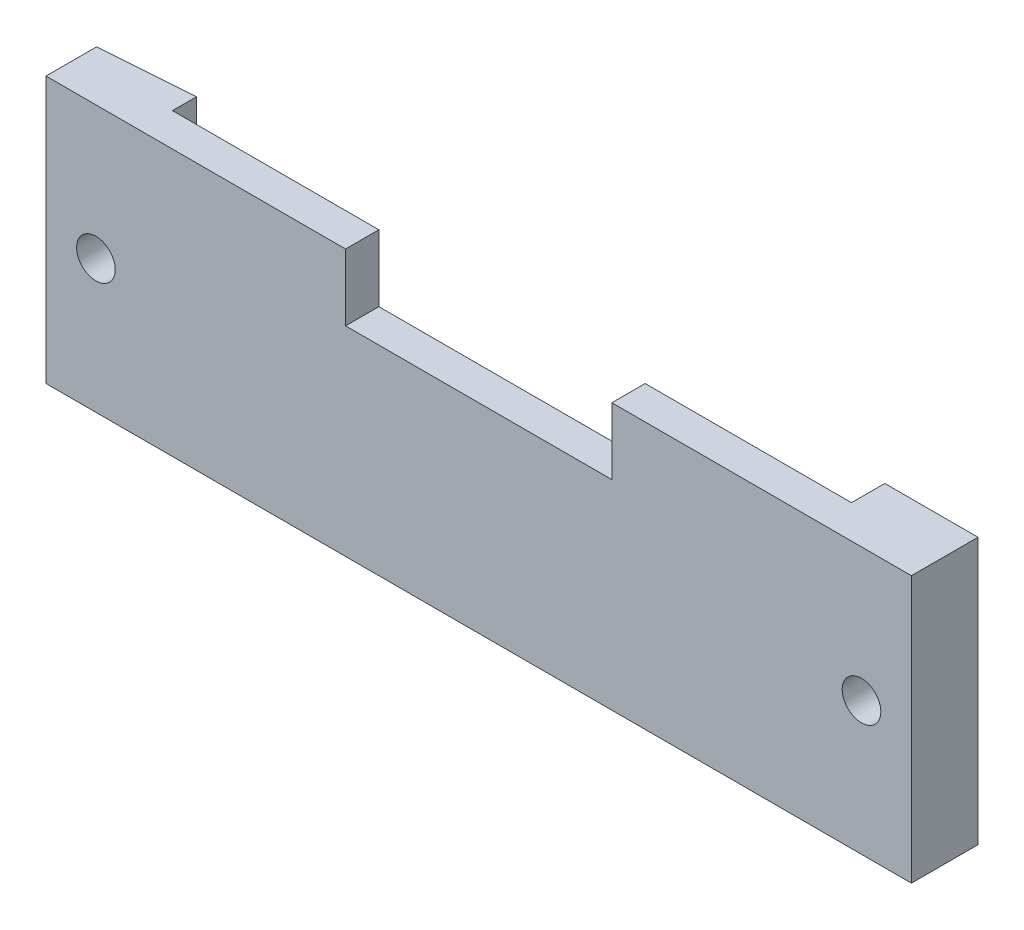
ISO-10303-21;
HEADER;
FILE_DESCRIPTION(('STEP AP214'),'2;1');
FILE_NAME('part.step','',(''),(''),'','','');
FILE_SCHEMA(('AUTOMOTIVE_DESIGN { 1 0 10303 214 1 1 1 1 }'));
ENDSEC;
DATA;
#1=APPLICATION_CONTEXT('core data for automotive mechanical design processes');
#2=APPLICATION_PROTOCOL_DEFINITION('international standard','automotive_design',2000,#1);
#3=PRODUCT_CONTEXT('',#1,'mechanical');
#4=PRODUCT('Part','Part','',(#3));
#5=PRODUCT_RELATED_PRODUCT_CATEGORY('part','',(#4));
#6=PRODUCT_DEFINITION_FORMATION('','',#4);
#7=PRODUCT_DEFINITION_CONTEXT('part definition',#1,'design');
#8=PRODUCT_DEFINITION('design','',#6,#7);
#9=PRODUCT_DEFINITION_SHAPE('','',#8);
#10=(LENGTH_UNIT() NAMED_UNIT(*) SI_UNIT(.MILLI.,.METRE.));
#11=(NAMED_UNIT(*) PLANE_ANGLE_UNIT() SI_UNIT($,.RADIAN.));
#12=(NAMED_UNIT(*) SI_UNIT($,.STERADIAN.) SOLID_ANGLE_UNIT());
#13=UNCERTAINTY_MEASURE_WITH_UNIT(LENGTH_MEASURE(1.E-05),#10,'distance_accuracy_value','');
#14=(GEOMETRIC_REPRESENTATION_CONTEXT(3) GLOBAL_UNCERTAINTY_ASSIGNED_CONTEXT((#13)) GLOBAL_UNIT_ASSIGNED_CONTEXT((#10,
#11,#12)) REPRESENTATION_CONTEXT('',''));
#15=CARTESIAN_POINT('',(0.,0.,0.));
#16=DIRECTION('',(0.,0.,1.));
#17=DIRECTION('',(1.,0.,0.));
#18=AXIS2_PLACEMENT_3D('',#15,#16,#17);
#19=CARTESIAN_POINT('',(32.5,20.,5.));
#20=DIRECTION('',(0.,-1.,0.));
#21=DIRECTION('',(1.,0.,0.));
#22=AXIS2_PLACEMENT_3D('',#19,#20,#21);
#23=PLANE('',#22);
#24=DIRECTION('',(1.,0.,0.));
#25=VECTOR('',#24,1.);
#26=CARTESIAN_POINT('',(-25.5,20.,2.5));
#27=LINE('',#26,#25);
#28=CARTESIAN_POINT('',(10.,20.,2.5));
#29=VERTEX_POINT('',#28);
#30=CARTESIAN_POINT('',(25.5,20.,2.5));
#31=VERTEX_POINT('',#30);
#32=EDGE_CURVE('E210',#29,#31,#27,.T.);
#33=ORIENTED_EDGE('',*,*,#32,.F.);
#34=DIRECTION('',(0.,0.,1.));
#35=VECTOR('',#34,1.);
#36=CARTESIAN_POINT('',(10.,20.,-0.001000000000001));
#37=LINE('',#36,#35);
#38=CARTESIAN_POINT('',(10.,20.,5.));
#39=VERTEX_POINT('',#38);
#40=EDGE_CURVE('E220',#29,#39,#37,.T.);
#41=ORIENTED_EDGE('',*,*,#40,.T.);
#42=DIRECTION('',(-1.,0.,0.));
#43=VECTOR('',#42,1.);
#44=CARTESIAN_POINT('',(32.5,20.,5.));
#45=LINE('',#44,#43);
#46=CARTESIAN_POINT('',(32.5,20.,5.));
#47=VERTEX_POINT('',#46);
#48=EDGE_CURVE('E170',#47,#39,#45,.T.);
#49=ORIENTED_EDGE('',*,*,#48,.F.);
#50=DIRECTION('',(0.,0.,-1.));
#51=VECTOR('',#50,1.);
#52=CARTESIAN_POINT('',(32.5,20.,5.));
#53=LINE('',#52,#51);
#54=CARTESIAN_POINT('',(32.5,20.,0.));
#55=VERTEX_POINT('',#54);
#56=EDGE_CURVE('E48',#47,#55,#53,.T.);
#57=ORIENTED_EDGE('',*,*,#56,.T.);
#58=DIRECTION('',(-1.,0.,0.));
#59=VECTOR('',#58,1.);
#60=CARTESIAN_POINT('',(32.5,20.,0.));
#61=LINE('',#60,#59);
#62=CARTESIAN_POINT('',(25.5,20.,0.));
#63=VERTEX_POINT('',#62);
#64=EDGE_CURVE('E167',#55,#63,#61,.T.);
#65=ORIENTED_EDGE('',*,*,#64,.T.);
#66=DIRECTION('',(0.,0.,-1.));
#67=VECTOR('',#66,1.);
#68=CARTESIAN_POINT('',(25.5,20.,2.5));
#69=LINE('',#68,#67);
#70=EDGE_CURVE('E160',#31,#63,#69,.T.);
#71=ORIENTED_EDGE('',*,*,#70,.F.);
#72=EDGE_LOOP('',(#33,#41,#49,#57,#65,#71));
#73=FACE_BOUND('',#72,.T.);
#74=ADVANCED_FACE('F40',(#73),#23,.F.);
#75=CARTESIAN_POINT('',(0.,0.,5.));
#76=DIRECTION('',(0.,1.,0.));
#77=DIRECTION('',(0.,0.,1.));
#78=AXIS2_PLACEMENT_3D('',#75,#76,#77);
#79=PLANE('',#78);
#80=DIRECTION('',(0.,0.,-1.));
#81=VECTOR('',#80,1.);
#82=CARTESIAN_POINT('',(-32.5,0.,5.));
#83=LINE('',#82,#81);
#84=CARTESIAN_POINT('',(-32.5,0.,5.));
#85=VERTEX_POINT('',#84);
#86=CARTESIAN_POINT('',(-32.5,0.,1.2));
#87=VERTEX_POINT('',#86);
#88=EDGE_CURVE('E144',#85,#87,#83,.T.);
#89=ORIENTED_EDGE('',*,*,#88,.T.);
#90=DIRECTION('',(-0.997458699830735,0.,0.0712470499879096));
#91=VECTOR('',#90,1.);
#92=CARTESIAN_POINT('',(-32.5,0.,1.2));
#93=LINE('',#92,#91);
#94=CARTESIAN_POINT('',(-25.5,0.,0.7));
#95=VERTEX_POINT('',#94);
#96=EDGE_CURVE('E130',#95,#87,#93,.T.);
#97=ORIENTED_EDGE('',*,*,#96,.F.);
#98=DIRECTION('',(0.,0.,-1.));
#99=VECTOR('',#98,1.);
#100=CARTESIAN_POINT('',(-25.5,0.,0.));
#101=LINE('',#100,#99);
#102=CARTESIAN_POINT('',(-25.5,0.,2.5));
#103=VERTEX_POINT('',#102);
#104=EDGE_CURVE('E141',#103,#95,#101,.T.);
#105=ORIENTED_EDGE('',*,*,#104,.F.);
#106=DIRECTION('',(-1.,0.,0.));
#107=VECTOR('',#106,1.);
#108=CARTESIAN_POINT('',(-25.5,0.,2.5));
#109=LINE('',#108,#107);
#110=CARTESIAN_POINT('',(25.5,0.,2.5));
#111=VERTEX_POINT('',#110);
#112=EDGE_CURVE('E151',#111,#103,#109,.T.);
#113=ORIENTED_EDGE('',*,*,#112,.F.);
#114=DIRECTION('',(0.,0.,1.));
#115=VECTOR('',#114,1.);
#116=CARTESIAN_POINT('',(25.5,0.,2.5));
#117=LINE('',#116,#115);
#118=CARTESIAN_POINT('',(25.5,0.,0.));
#119=VERTEX_POINT('',#118);
#120=EDGE_CURVE('E155',#119,#111,#117,.T.);
#121=ORIENTED_EDGE('',*,*,#120,.F.);
#122=DIRECTION('',(1.,0.,0.));
#123=VECTOR('',#122,1.);
#124=CARTESIAN_POINT('',(0.,0.,0.));
#125=LINE('',#124,#123);
#126=CARTESIAN_POINT('',(32.5,0.,0.));
#127=VERTEX_POINT('',#126);
#128=EDGE_CURVE('E163',#119,#127,#125,.T.);
#129=ORIENTED_EDGE('',*,*,#128,.T.);
#130=DIRECTION('',(0.,0.,-1.));
#131=VECTOR('',#130,1.);
#132=CARTESIAN_POINT('',(32.5,0.,5.));
#133=LINE('',#132,#131);
#134=CARTESIAN_POINT('',(32.5,0.,5.));
#135=VERTEX_POINT('',#134);
#136=EDGE_CURVE('E11',#135,#127,#133,.T.);
#137=ORIENTED_EDGE('',*,*,#136,.F.);
#138=DIRECTION('',(1.,0.,0.));
#139=VECTOR('',#138,1.);
#140=CARTESIAN_POINT('',(0.,0.,5.));
#141=LINE('',#140,#139);
#142=EDGE_CURVE('E164',#85,#135,#141,.T.);
#143=ORIENTED_EDGE('',*,*,#142,.F.);
#144=EDGE_LOOP('',(#89,#97,#105,#113,#121,#129,#137,#143));
#145=FACE_BOUND('',#144,.T.);
#146=ADVANCED_FACE('F42',(#145),#79,.F.);
#147=CARTESIAN_POINT('',(32.5,0.,5.));
#148=DIRECTION('',(-1.,0.,0.));
#149=DIRECTION('',(0.,0.,1.));
#150=AXIS2_PLACEMENT_3D('',#147,#148,#149);
#151=PLANE('',#150);
#152=DIRECTION('',(0.,1.,0.));
#153=VECTOR('',#152,1.);
#154=CARTESIAN_POINT('',(32.5,0.,0.));
#155=LINE('',#154,#153);
#156=EDGE_CURVE('E176',#127,#55,#155,.T.);
#157=ORIENTED_EDGE('',*,*,#156,.T.);
#158=ORIENTED_EDGE('',*,*,#56,.F.);
#159=DIRECTION('',(0.,1.,0.));
#160=VECTOR('',#159,1.);
#161=CARTESIAN_POINT('',(32.5,0.,5.));
#162=LINE('',#161,#160);
#163=EDGE_CURVE('E166',#135,#47,#162,.T.);
#164=ORIENTED_EDGE('',*,*,#163,.F.);
#165=ORIENTED_EDGE('',*,*,#136,.T.);
#166=EDGE_LOOP('',(#157,#158,#164,#165));
#167=FACE_BOUND('',#166,.T.);
#168=ADVANCED_FACE('F264',(#167),#151,.F.);
#169=DIRECTION('',(0.,0.,1.));
#170=VECTOR('',#169,1.);
#171=CARTESIAN_POINT('',(-25.5,20.,0.));
#172=LINE('',#171,#170);
#173=CARTESIAN_POINT('',(-25.5,20.,0.7));
#174=VERTEX_POINT('',#173);
#175=CARTESIAN_POINT('',(-25.5,20.,2.5));
#176=VERTEX_POINT('',#175);
#177=EDGE_CURVE('E204',#174,#176,#172,.T.);
#178=ORIENTED_EDGE('',*,*,#177,.F.);
#179=DIRECTION('',(0.997458699830735,0.,-0.0712470499879096));
#180=VECTOR('',#179,1.);
#181=CARTESIAN_POINT('',(-32.5,20.,1.2));
#182=LINE('',#181,#180);
#183=CARTESIAN_POINT('',(-32.5,20.,1.2));
#184=VERTEX_POINT('',#183);
#185=EDGE_CURVE('E55',#184,#174,#182,.T.);
#186=ORIENTED_EDGE('',*,*,#185,.F.);
#187=DIRECTION('',(0.,0.,-1.));
#188=VECTOR('',#187,1.);
#189=CARTESIAN_POINT('',(-32.5,20.,5.));
#190=LINE('',#189,#188);
#191=CARTESIAN_POINT('',(-32.5,20.,5.));
#192=VERTEX_POINT('',#191);
#193=EDGE_CURVE('E181',#192,#184,#190,.T.);
#194=ORIENTED_EDGE('',*,*,#193,.F.);
#195=CARTESIAN_POINT('',(-10.,20.,5.));
#196=VERTEX_POINT('',#195);
#197=EDGE_CURVE('E169',#196,#192,#45,.T.);
#198=ORIENTED_EDGE('',*,*,#197,.F.);
#199=DIRECTION('',(0.,0.,1.));
#200=VECTOR('',#199,1.);
#201=CARTESIAN_POINT('',(-10.,20.,-0.001000000000001));
#202=LINE('',#201,#200);
#203=CARTESIAN_POINT('',(-10.,20.,2.5));
#204=VERTEX_POINT('',#203);
#205=EDGE_CURVE('E221',#204,#196,#202,.T.);
#206=ORIENTED_EDGE('',*,*,#205,.F.);
#207=EDGE_CURVE('E205',#176,#204,#27,.T.);
#208=ORIENTED_EDGE('',*,*,#207,.F.);
#209=EDGE_LOOP('',(#178,#186,#194,#198,#206,#208));
#210=FACE_BOUND('',#209,.T.);
#211=ADVANCED_FACE('F251',(#210),#23,.F.);
#212=CARTESIAN_POINT('',(-32.5,0.,5.));
#213=DIRECTION('',(1.,0.,0.));
#214=DIRECTION('',(0.,0.,-1.));
#215=AXIS2_PLACEMENT_3D('',#212,#213,#214);
#216=PLANE('',#215);
#217=ORIENTED_EDGE('',*,*,#193,.T.);
#218=DIRECTION('',(0.,-1.,0.));
#219=VECTOR('',#218,1.);
#220=CARTESIAN_POINT('',(-32.5,20.001,1.2));
#221=LINE('',#220,#219);
#222=EDGE_CURVE('E135',#184,#87,#221,.T.);
#223=ORIENTED_EDGE('',*,*,#222,.T.);
#224=ORIENTED_EDGE('',*,*,#88,.F.);
#225=DIRECTION('',(0.,-1.,0.));
#226=VECTOR('',#225,1.);
#227=CARTESIAN_POINT('',(-32.5,0.,5.));
#228=LINE('',#227,#226);
#229=EDGE_CURVE('E173',#192,#85,#228,.T.);
#230=ORIENTED_EDGE('',*,*,#229,.F.);
#231=EDGE_LOOP('',(#217,#223,#224,#230));
#232=FACE_BOUND('',#231,.T.);
#233=ADVANCED_FACE('F247',(#232),#216,.F.);
#234=CARTESIAN_POINT('',(0.,0.,5.));
#235=DIRECTION('',(0.,0.,-1.));
#236=DIRECTION('',(-1.,0.,0.));
#237=AXIS2_PLACEMENT_3D('',#234,#235,#236);
#238=PLANE('',#237);
#239=CARTESIAN_POINT('',(-28.75,9.99999999999999,5.));
#240=DIRECTION('',(0.,0.,1.));
#241=DIRECTION('',(1.,0.,0.));
#242=AXIS2_PLACEMENT_3D('',#239,#240,#241);
#243=CIRCLE('',#242,1.44999999999999);
#244=CARTESIAN_POINT('',(-27.3,9.99999999999999,5.));
#245=VERTEX_POINT('',#244);
#246=EDGE_CURVE('E217',#245,#245,#243,.T.);
#247=ORIENTED_EDGE('',*,*,#246,.F.);
#248=EDGE_LOOP('',(#247));
#249=FACE_BOUND('',#248,.T.);
#250=CARTESIAN_POINT('',(28.75,10.,5.));
#251=DIRECTION('',(0.,0.,1.));
#252=DIRECTION('',(1.,0.,0.));
#253=AXIS2_PLACEMENT_3D('',#250,#251,#252);
#254=CIRCLE('',#253,1.44999999999999);
#255=CARTESIAN_POINT('',(30.2,10.,5.));
#256=VERTEX_POINT('',#255);
#257=EDGE_CURVE('E214',#256,#256,#254,.T.);
#258=ORIENTED_EDGE('',*,*,#257,.F.);
#259=EDGE_LOOP('',(#258));
#260=FACE_BOUND('',#259,.T.);
#261=ORIENTED_EDGE('',*,*,#48,.T.);
#262=DIRECTION('',(0.,1.,0.));
#263=VECTOR('',#262,1.);
#264=CARTESIAN_POINT('',(10.,15.,5.));
#265=LINE('',#264,#263);
#266=CARTESIAN_POINT('',(10.,15.,5.));
#267=VERTEX_POINT('',#266);
#268=EDGE_CURVE('E224',#267,#39,#265,.T.);
#269=ORIENTED_EDGE('',*,*,#268,.F.);
#270=DIRECTION('',(1.,0.,0.));
#271=VECTOR('',#270,1.);
#272=CARTESIAN_POINT('',(-10.,15.,5.));
#273=LINE('',#272,#271);
#274=CARTESIAN_POINT('',(-10.,15.,5.));
#275=VERTEX_POINT('',#274);
#276=EDGE_CURVE('E230',#275,#267,#273,.T.);
#277=ORIENTED_EDGE('',*,*,#276,.F.);
#278=DIRECTION('',(0.,-1.,0.));
#279=VECTOR('',#278,1.);
#280=CARTESIAN_POINT('',(-10.,20.,5.));
#281=LINE('',#280,#279);
#282=EDGE_CURVE('E233',#196,#275,#281,.T.);
#283=ORIENTED_EDGE('',*,*,#282,.F.);
#284=ORIENTED_EDGE('',*,*,#197,.T.);
#285=ORIENTED_EDGE('',*,*,#229,.T.);
#286=ORIENTED_EDGE('',*,*,#142,.T.);
#287=ORIENTED_EDGE('',*,*,#163,.T.);
#288=EDGE_LOOP('',(#261,#269,#277,#283,#284,#285,#286,#287));
#289=FACE_BOUND('',#288,.T.);
#290=ADVANCED_FACE('F262',(#249,#260,#289),#238,.F.);
#291=CARTESIAN_POINT('',(0.,0.,0.));
#292=DIRECTION('',(0.,0.,-1.));
#293=DIRECTION('',(-1.,0.,0.));
#294=AXIS2_PLACEMENT_3D('',#291,#292,#293);
#295=PLANE('',#294);
#296=CARTESIAN_POINT('',(28.75,10.,0.));
#297=DIRECTION('',(0.,0.,-1.));
#298=DIRECTION('',(-1.,0.,0.));
#299=AXIS2_PLACEMENT_3D('',#296,#297,#298);
#300=CIRCLE('',#299,1.44999999999999);
#301=CARTESIAN_POINT('',(27.3,10.,0.));
#302=VERTEX_POINT('',#301);
#303=EDGE_CURVE('E211',#302,#302,#300,.T.);
#304=ORIENTED_EDGE('',*,*,#303,.F.);
#305=EDGE_LOOP('',(#304));
#306=FACE_BOUND('',#305,.T.);
#307=DIRECTION('',(0.,-1.,0.));
#308=VECTOR('',#307,1.);
#309=CARTESIAN_POINT('',(25.5,20.001,0.));
#310=LINE('',#309,#308);
#311=EDGE_CURVE('E150',#63,#119,#310,.T.);
#312=ORIENTED_EDGE('',*,*,#311,.F.);
#313=ORIENTED_EDGE('',*,*,#64,.F.);
#314=ORIENTED_EDGE('',*,*,#156,.F.);
#315=ORIENTED_EDGE('',*,*,#128,.F.);
#316=EDGE_LOOP('',(#312,#313,#314,#315));
#317=FACE_BOUND('',#316,.T.);
#318=ADVANCED_FACE('F196',(#306,#317),#295,.T.);
#319=CARTESIAN_POINT('',(-25.5,20.001,0.));
#320=DIRECTION('',(-1.,0.,0.));
#321=DIRECTION('',(0.,0.,1.));
#322=AXIS2_PLACEMENT_3D('',#319,#320,#321);
#323=PLANE('',#322);
#324=ORIENTED_EDGE('',*,*,#104,.T.);
#325=DIRECTION('',(0.,-1.,0.));
#326=VECTOR('',#325,1.);
#327=CARTESIAN_POINT('',(-25.5,20.001,0.7));
#328=LINE('',#327,#326);
#329=EDGE_CURVE('E126',#174,#95,#328,.T.);
#330=ORIENTED_EDGE('',*,*,#329,.F.);
#331=ORIENTED_EDGE('',*,*,#177,.T.);
#332=DIRECTION('',(0.,-1.,0.));
#333=VECTOR('',#332,1.);
#334=CARTESIAN_POINT('',(-25.5,20.001,2.5));
#335=LINE('',#334,#333);
#336=EDGE_CURVE('E148',#176,#103,#335,.T.);
#337=ORIENTED_EDGE('',*,*,#336,.T.);
#338=EDGE_LOOP('',(#324,#330,#331,#337));
#339=FACE_BOUND('',#338,.T.);
#340=ADVANCED_FACE('F146',(#339),#323,.F.);
#341=CARTESIAN_POINT('',(-25.5,20.001,2.5));
#342=DIRECTION('',(0.,0.,1.));
#343=DIRECTION('',(1.,0.,0.));
#344=AXIS2_PLACEMENT_3D('',#341,#342,#343);
#345=PLANE('',#344);
#346=DIRECTION('',(-1.,0.,0.));
#347=VECTOR('',#346,1.);
#348=CARTESIAN_POINT('',(-10.,15.,2.5));
#349=LINE('',#348,#347);
#350=CARTESIAN_POINT('',(10.,15.,2.5));
#351=VERTEX_POINT('',#350);
#352=CARTESIAN_POINT('',(-10.,15.,2.5));
#353=VERTEX_POINT('',#352);
#354=EDGE_CURVE('E63',#351,#353,#349,.T.);
#355=ORIENTED_EDGE('',*,*,#354,.F.);
#356=DIRECTION('',(0.,-1.,0.));
#357=VECTOR('',#356,1.);
#358=CARTESIAN_POINT('',(10.,15.,2.5));
#359=LINE('',#358,#357);
#360=EDGE_CURVE('E236',#29,#351,#359,.T.);
#361=ORIENTED_EDGE('',*,*,#360,.F.);
#362=ORIENTED_EDGE('',*,*,#32,.T.);
#363=DIRECTION('',(0.,-1.,0.));
#364=VECTOR('',#363,1.);
#365=CARTESIAN_POINT('',(25.5,20.001,2.5));
#366=LINE('',#365,#364);
#367=EDGE_CURVE('E153',#31,#111,#366,.T.);
#368=ORIENTED_EDGE('',*,*,#367,.T.);
#369=ORIENTED_EDGE('',*,*,#112,.T.);
#370=ORIENTED_EDGE('',*,*,#336,.F.);
#371=ORIENTED_EDGE('',*,*,#207,.T.);
#372=DIRECTION('',(0.,1.,0.));
#373=VECTOR('',#372,1.);
#374=CARTESIAN_POINT('',(-10.,20.,2.5));
#375=LINE('',#374,#373);
#376=EDGE_CURVE('E240',#353,#204,#375,.T.);
#377=ORIENTED_EDGE('',*,*,#376,.F.);
#378=EDGE_LOOP('',(#355,#361,#362,#368,#369,#370,#371,#377));
#379=FACE_BOUND('',#378,.T.);
#380=ADVANCED_FACE('F256',(#379),#345,.F.);
#381=CARTESIAN_POINT('',(25.5,20.001,2.5));
#382=DIRECTION('',(1.,0.,0.));
#383=DIRECTION('',(0.,0.,-1.));
#384=AXIS2_PLACEMENT_3D('',#381,#382,#383);
#385=PLANE('',#384);
#386=ORIENTED_EDGE('',*,*,#70,.T.);
#387=ORIENTED_EDGE('',*,*,#311,.T.);
#388=ORIENTED_EDGE('',*,*,#120,.T.);
#389=ORIENTED_EDGE('',*,*,#367,.F.);
#390=EDGE_LOOP('',(#386,#387,#388,#389));
#391=FACE_BOUND('',#390,.T.);
#392=ADVANCED_FACE('F201',(#391),#385,.F.);
#393=CARTESIAN_POINT('',(28.75,10.,5.));
#394=DIRECTION('',(0.,0.,1.));
#395=DIRECTION('',(1.,0.,0.));
#396=AXIS2_PLACEMENT_3D('',#393,#394,#395);
#397=CYLINDRICAL_SURFACE('',#396,1.44999999999999);
#398=ORIENTED_EDGE('',*,*,#257,.T.);
#399=EDGE_LOOP('',(#398));
#400=FACE_BOUND('',#399,.T.);
#401=ORIENTED_EDGE('',*,*,#303,.T.);
#402=EDGE_LOOP('',(#401));
#403=FACE_BOUND('',#402,.T.);
#404=ADVANCED_FACE('F285',(#400,#403),#397,.F.);
#405=CARTESIAN_POINT('',(-28.75,9.99999999999999,5.));
#406=DIRECTION('',(0.,0.,1.));
#407=DIRECTION('',(1.,0.,0.));
#408=AXIS2_PLACEMENT_3D('',#405,#406,#407);
#409=CYLINDRICAL_SURFACE('',#408,1.44999999999999);
#410=CARTESIAN_POINT('',(-28.75,9.99999999999999,0.932142857142858));
#411=DIRECTION('',(0.0712470499879096,0.,0.997458699830735));
#412=DIRECTION('',(-0.997458699830735,0.,0.0712470499879096));
#413=AXIS2_PLACEMENT_3D('',#410,#411,#412);
#414=ELLIPSE('',#413,1.45369427350331,1.44999999999999);
#415=CARTESIAN_POINT('',(-30.2,9.99999999999999,1.03571428571429));
#416=VERTEX_POINT('',#415);
#417=EDGE_CURVE('E242',#416,#416,#414,.T.);
#418=ORIENTED_EDGE('',*,*,#417,.F.);
#419=EDGE_LOOP('',(#418));
#420=FACE_BOUND('',#419,.T.);
#421=ORIENTED_EDGE('',*,*,#246,.T.);
#422=EDGE_LOOP('',(#421));
#423=FACE_BOUND('',#422,.T.);
#424=ADVANCED_FACE('F292',(#420,#423),#409,.F.);
#425=CARTESIAN_POINT('',(10.,15.,-0.001000000000001));
#426=DIRECTION('',(1.,0.,0.));
#427=DIRECTION('',(0.,0.,-1.));
#428=AXIS2_PLACEMENT_3D('',#425,#426,#427);
#429=PLANE('',#428);
#430=ORIENTED_EDGE('',*,*,#360,.T.);
#431=DIRECTION('',(0.,0.,1.));
#432=VECTOR('',#431,1.);
#433=CARTESIAN_POINT('',(10.,15.,-0.001000000000001));
#434=LINE('',#433,#432);
#435=EDGE_CURVE('E226',#351,#267,#434,.T.);
#436=ORIENTED_EDGE('',*,*,#435,.T.);
#437=ORIENTED_EDGE('',*,*,#268,.T.);
#438=ORIENTED_EDGE('',*,*,#40,.F.);
#439=EDGE_LOOP('',(#430,#436,#437,#438));
#440=FACE_BOUND('',#439,.T.);
#441=ADVANCED_FACE('F296',(#440),#429,.F.);
#442=CARTESIAN_POINT('',(-10.,15.,-0.001000000000001));
#443=DIRECTION('',(0.,-1.,0.));
#444=DIRECTION('',(0.,0.,-1.));
#445=AXIS2_PLACEMENT_3D('',#442,#443,#444);
#446=PLANE('',#445);
#447=ORIENTED_EDGE('',*,*,#354,.T.);
#448=DIRECTION('',(0.,0.,1.));
#449=VECTOR('',#448,1.);
#450=CARTESIAN_POINT('',(-10.,15.,-0.001000000000001));
#451=LINE('',#450,#449);
#452=EDGE_CURVE('E223',#353,#275,#451,.T.);
#453=ORIENTED_EDGE('',*,*,#452,.T.);
#454=ORIENTED_EDGE('',*,*,#276,.T.);
#455=ORIENTED_EDGE('',*,*,#435,.F.);
#456=EDGE_LOOP('',(#447,#453,#454,#455));
#457=FACE_BOUND('',#456,.T.);
#458=ADVANCED_FACE('F301',(#457),#446,.F.);
#459=CARTESIAN_POINT('',(-10.,20.,-0.001000000000001));
#460=DIRECTION('',(-1.,0.,0.));
#461=DIRECTION('',(0.,0.,1.));
#462=AXIS2_PLACEMENT_3D('',#459,#460,#461);
#463=PLANE('',#462);
#464=ORIENTED_EDGE('',*,*,#376,.T.);
#465=ORIENTED_EDGE('',*,*,#205,.T.);
#466=ORIENTED_EDGE('',*,*,#282,.T.);
#467=ORIENTED_EDGE('',*,*,#452,.F.);
#468=EDGE_LOOP('',(#464,#465,#466,#467));
#469=FACE_BOUND('',#468,.T.);
#470=ADVANCED_FACE('F298',(#469),#463,.F.);
#471=CARTESIAN_POINT('',(-32.5,20.001,1.2));
#472=DIRECTION('',(0.0712470499879096,0.,0.997458699830735));
#473=DIRECTION('',(0.997458699830735,0.,-0.0712470499879096));
#474=AXIS2_PLACEMENT_3D('',#471,#472,#473);
#475=PLANE('',#474);
#476=ORIENTED_EDGE('',*,*,#185,.T.);
#477=ORIENTED_EDGE('',*,*,#329,.T.);
#478=ORIENTED_EDGE('',*,*,#96,.T.);
#479=ORIENTED_EDGE('',*,*,#222,.F.);
#480=EDGE_LOOP('',(#476,#477,#478,#479));
#481=FACE_BOUND('',#480,.T.);
#482=ORIENTED_EDGE('',*,*,#417,.T.);
#483=EDGE_LOOP('',(#482));
#484=FACE_BOUND('',#483,.T.);
#485=ADVANCED_FACE('F128',(#481,#484),#475,.F.);
#486=CLOSED_SHELL('',(#74,#146,#168,#211,#233,#290,#318,#340,#380,#392,#404,#424,#441,#458,#470,#485));
#487=MANIFOLD_SOLID_BREP('B2',#486);
#488=ADVANCED_BREP_SHAPE_REPRESENTATION('',(#18,#487),#14);
#489=SHAPE_DEFINITION_REPRESENTATION(#9,#488);
ENDSEC;
END-ISO-10303-21;
